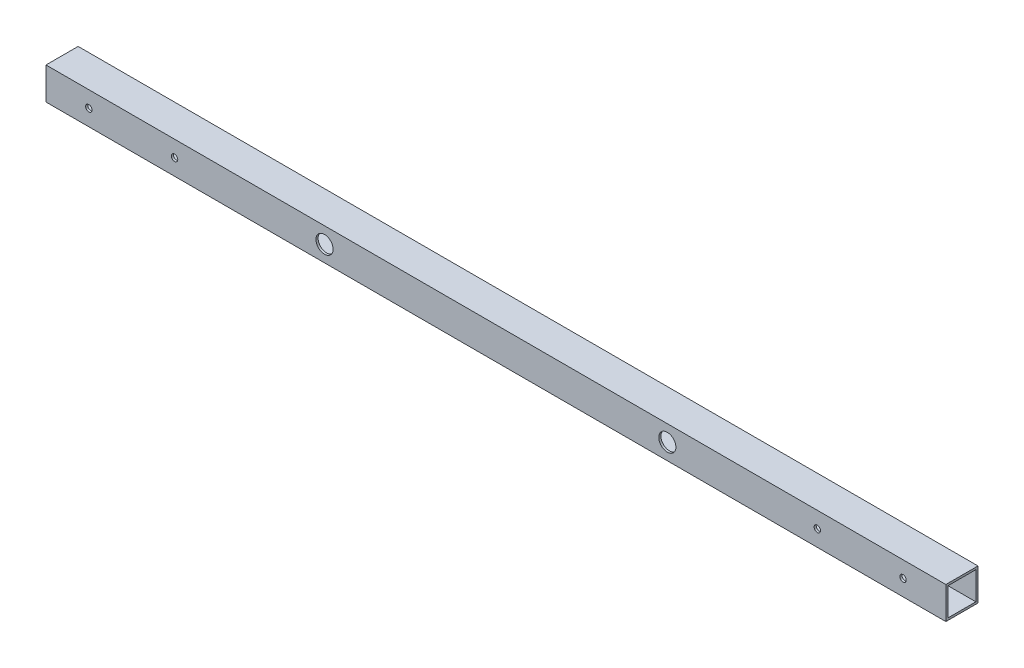
ISO-10303-21;
HEADER;
FILE_DESCRIPTION(('STEP AP214'),'2;1');
FILE_NAME('part.step','',(''),(''),'','','');
FILE_SCHEMA(('AUTOMOTIVE_DESIGN { 1 0 10303 214 1 1 1 1 }'));
ENDSEC;
DATA;
#1=APPLICATION_CONTEXT('core data for automotive mechanical design processes');
#2=APPLICATION_PROTOCOL_DEFINITION('international standard','automotive_design',2000,#1);
#3=PRODUCT_CONTEXT('',#1,'mechanical');
#4=PRODUCT('Part','Part','',(#3));
#5=PRODUCT_RELATED_PRODUCT_CATEGORY('part','',(#4));
#6=PRODUCT_DEFINITION_FORMATION('','',#4);
#7=PRODUCT_DEFINITION_CONTEXT('part definition',#1,'design');
#8=PRODUCT_DEFINITION('design','',#6,#7);
#9=PRODUCT_DEFINITION_SHAPE('','',#8);
#10=(LENGTH_UNIT() NAMED_UNIT(*) SI_UNIT(.MILLI.,.METRE.));
#11=(NAMED_UNIT(*) PLANE_ANGLE_UNIT() SI_UNIT($,.RADIAN.));
#12=(NAMED_UNIT(*) SI_UNIT($,.STERADIAN.) SOLID_ANGLE_UNIT());
#13=UNCERTAINTY_MEASURE_WITH_UNIT(LENGTH_MEASURE(1.E-05),#10,'distance_accuracy_value','');
#14=(GEOMETRIC_REPRESENTATION_CONTEXT(3) GLOBAL_UNCERTAINTY_ASSIGNED_CONTEXT((#13)) GLOBAL_UNIT_ASSIGNED_CONTEXT((#10,
#11,#12)) REPRESENTATION_CONTEXT('',''));
#15=CARTESIAN_POINT('',(0.,0.,0.));
#16=DIRECTION('',(0.,0.,1.));
#17=DIRECTION('',(1.,0.,0.));
#18=AXIS2_PLACEMENT_3D('',#15,#16,#17);
#19=CARTESIAN_POINT('',(420.,0.,0.));
#20=DIRECTION('',(-1.,0.,0.));
#21=DIRECTION('',(0.,0.,1.));
#22=AXIS2_PLACEMENT_3D('',#19,#20,#21);
#23=PLANE('',#22);
#24=DIRECTION('',(0.,1.,0.));
#25=VECTOR('',#24,1.);
#26=CARTESIAN_POINT('',(420.,-7.5,-7.5));
#27=LINE('',#26,#25);
#28=CARTESIAN_POINT('',(420.,-7.5,-7.5));
#29=VERTEX_POINT('',#28);
#30=CARTESIAN_POINT('',(420.,7.5,-7.5));
#31=VERTEX_POINT('',#30);
#32=EDGE_CURVE('E142',#29,#31,#27,.T.);
#33=ORIENTED_EDGE('',*,*,#32,.T.);
#34=DIRECTION('',(0.,0.,1.));
#35=VECTOR('',#34,1.);
#36=CARTESIAN_POINT('',(420.,7.5,7.5));
#37=LINE('',#36,#35);
#38=CARTESIAN_POINT('',(420.,7.5,7.5));
#39=VERTEX_POINT('',#38);
#40=EDGE_CURVE('E145',#31,#39,#37,.T.);
#41=ORIENTED_EDGE('',*,*,#40,.T.);
#42=DIRECTION('',(0.,-1.,0.));
#43=VECTOR('',#42,1.);
#44=CARTESIAN_POINT('',(420.,-7.5,7.5));
#45=LINE('',#44,#43);
#46=CARTESIAN_POINT('',(420.,-7.5,7.5));
#47=VERTEX_POINT('',#46);
#48=EDGE_CURVE('E148',#39,#47,#45,.T.);
#49=ORIENTED_EDGE('',*,*,#48,.T.);
#50=DIRECTION('',(0.,0.,-1.));
#51=VECTOR('',#50,1.);
#52=CARTESIAN_POINT('',(420.,-7.5,7.5));
#53=LINE('',#52,#51);
#54=EDGE_CURVE('E150',#47,#29,#53,.T.);
#55=ORIENTED_EDGE('',*,*,#54,.T.);
#56=EDGE_LOOP('',(#33,#41,#49,#55));
#57=FACE_BOUND('',#56,.T.);
#58=DIRECTION('',(0.,-1.,0.));
#59=VECTOR('',#58,1.);
#60=CARTESIAN_POINT('',(420.,-6.5,6.5));
#61=LINE('',#60,#59);
#62=CARTESIAN_POINT('',(420.,6.5,6.5));
#63=VERTEX_POINT('',#62);
#64=CARTESIAN_POINT('',(420.,-6.5,6.5));
#65=VERTEX_POINT('',#64);
#66=EDGE_CURVE('E104',#63,#65,#61,.T.);
#67=ORIENTED_EDGE('',*,*,#66,.F.);
#68=DIRECTION('',(0.,0.,1.));
#69=VECTOR('',#68,1.);
#70=CARTESIAN_POINT('',(420.,6.5,6.5));
#71=LINE('',#70,#69);
#72=CARTESIAN_POINT('',(420.,6.5,-6.5));
#73=VERTEX_POINT('',#72);
#74=EDGE_CURVE('E126',#73,#63,#71,.T.);
#75=ORIENTED_EDGE('',*,*,#74,.F.);
#76=DIRECTION('',(0.,1.,0.));
#77=VECTOR('',#76,1.);
#78=CARTESIAN_POINT('',(420.,-6.5,-6.5));
#79=LINE('',#78,#77);
#80=CARTESIAN_POINT('',(420.,-6.5,-6.5));
#81=VERTEX_POINT('',#80);
#82=EDGE_CURVE('E124',#81,#73,#79,.T.);
#83=ORIENTED_EDGE('',*,*,#82,.F.);
#84=DIRECTION('',(0.,0.,-1.));
#85=VECTOR('',#84,1.);
#86=CARTESIAN_POINT('',(420.,-6.5,6.5));
#87=LINE('',#86,#85);
#88=EDGE_CURVE('E112',#65,#81,#87,.T.);
#89=ORIENTED_EDGE('',*,*,#88,.F.);
#90=EDGE_LOOP('',(#67,#75,#83,#89));
#91=FACE_BOUND('',#90,.T.);
#92=ADVANCED_FACE('F37',(#57,#91),#23,.F.);
#93=CARTESIAN_POINT('',(0.,0.,0.));
#94=DIRECTION('',(-1.,0.,0.));
#95=DIRECTION('',(0.,0.,1.));
#96=AXIS2_PLACEMENT_3D('',#93,#94,#95);
#97=PLANE('',#96);
#98=DIRECTION('',(0.,1.,0.));
#99=VECTOR('',#98,1.);
#100=CARTESIAN_POINT('',(0.,-7.5,-7.5));
#101=LINE('',#100,#99);
#102=CARTESIAN_POINT('',(0.,-7.5,-7.5));
#103=VERTEX_POINT('',#102);
#104=CARTESIAN_POINT('',(0.,7.5,-7.5));
#105=VERTEX_POINT('',#104);
#106=EDGE_CURVE('E120',#103,#105,#101,.T.);
#107=ORIENTED_EDGE('',*,*,#106,.F.);
#108=DIRECTION('',(0.,0.,-1.));
#109=VECTOR('',#108,1.);
#110=CARTESIAN_POINT('',(0.,-7.5,7.5));
#111=LINE('',#110,#109);
#112=CARTESIAN_POINT('',(0.,-7.5,7.5));
#113=VERTEX_POINT('',#112);
#114=EDGE_CURVE('E146',#113,#103,#111,.T.);
#115=ORIENTED_EDGE('',*,*,#114,.F.);
#116=DIRECTION('',(0.,-1.,0.));
#117=VECTOR('',#116,1.);
#118=CARTESIAN_POINT('',(0.,-7.5,7.5));
#119=LINE('',#118,#117);
#120=CARTESIAN_POINT('',(0.,7.5,7.5));
#121=VERTEX_POINT('',#120);
#122=EDGE_CURVE('E157',#121,#113,#119,.T.);
#123=ORIENTED_EDGE('',*,*,#122,.F.);
#124=DIRECTION('',(0.,0.,1.));
#125=VECTOR('',#124,1.);
#126=CARTESIAN_POINT('',(0.,7.5,7.5));
#127=LINE('',#126,#125);
#128=EDGE_CURVE('E155',#105,#121,#127,.T.);
#129=ORIENTED_EDGE('',*,*,#128,.F.);
#130=EDGE_LOOP('',(#107,#115,#123,#129));
#131=FACE_BOUND('',#130,.T.);
#132=DIRECTION('',(0.,0.,1.));
#133=VECTOR('',#132,1.);
#134=CARTESIAN_POINT('',(0.,6.5,6.5));
#135=LINE('',#134,#133);
#136=CARTESIAN_POINT('',(0.,6.5,-6.5));
#137=VERTEX_POINT('',#136);
#138=CARTESIAN_POINT('',(0.,6.5,6.5));
#139=VERTEX_POINT('',#138);
#140=EDGE_CURVE('E113',#137,#139,#135,.T.);
#141=ORIENTED_EDGE('',*,*,#140,.T.);
#142=DIRECTION('',(0.,-1.,0.));
#143=VECTOR('',#142,1.);
#144=CARTESIAN_POINT('',(0.,-6.5,6.5));
#145=LINE('',#144,#143);
#146=CARTESIAN_POINT('',(0.,-6.5,6.5));
#147=VERTEX_POINT('',#146);
#148=EDGE_CURVE('E62',#139,#147,#145,.T.);
#149=ORIENTED_EDGE('',*,*,#148,.T.);
#150=DIRECTION('',(0.,0.,-1.));
#151=VECTOR('',#150,1.);
#152=CARTESIAN_POINT('',(0.,-6.5,6.5));
#153=LINE('',#152,#151);
#154=CARTESIAN_POINT('',(0.,-6.5,-6.5));
#155=VERTEX_POINT('',#154);
#156=EDGE_CURVE('E119',#147,#155,#153,.T.);
#157=ORIENTED_EDGE('',*,*,#156,.T.);
#158=DIRECTION('',(0.,1.,0.));
#159=VECTOR('',#158,1.);
#160=CARTESIAN_POINT('',(0.,-6.5,-6.5));
#161=LINE('',#160,#159);
#162=EDGE_CURVE('E134',#155,#137,#161,.T.);
#163=ORIENTED_EDGE('',*,*,#162,.T.);
#164=EDGE_LOOP('',(#141,#149,#157,#163));
#165=FACE_BOUND('',#164,.T.);
#166=ADVANCED_FACE('F258',(#131,#165),#97,.T.);
#167=CARTESIAN_POINT('',(420.,-7.5,-7.5));
#168=DIRECTION('',(0.,0.,1.));
#169=DIRECTION('',(1.,0.,0.));
#170=AXIS2_PLACEMENT_3D('',#167,#168,#169);
#171=PLANE('',#170);
#172=CARTESIAN_POINT('',(60.,0.,-7.5));
#173=DIRECTION('',(0.,0.,1.));
#174=DIRECTION('',(1.,0.,0.));
#175=AXIS2_PLACEMENT_3D('',#172,#173,#174);
#176=CIRCLE('',#175,1.5);
#177=CARTESIAN_POINT('',(61.5,0.,-7.5));
#178=VERTEX_POINT('',#177);
#179=EDGE_CURVE('E175',#178,#178,#176,.T.);
#180=ORIENTED_EDGE('',*,*,#179,.T.);
#181=EDGE_LOOP('',(#180));
#182=FACE_BOUND('',#181,.T.);
#183=CARTESIAN_POINT('',(130.,0.,-7.5));
#184=DIRECTION('',(0.,0.,1.));
#185=DIRECTION('',(1.,0.,0.));
#186=AXIS2_PLACEMENT_3D('',#183,#184,#185);
#187=CIRCLE('',#186,1.5);
#188=CARTESIAN_POINT('',(131.5,0.,-7.5));
#189=VERTEX_POINT('',#188);
#190=EDGE_CURVE('E211',#189,#189,#187,.T.);
#191=ORIENTED_EDGE('',*,*,#190,.T.);
#192=EDGE_LOOP('',(#191));
#193=FACE_BOUND('',#192,.T.);
#194=CARTESIAN_POINT('',(290.,0.,-7.5));
#195=DIRECTION('',(0.,0.,1.));
#196=DIRECTION('',(-1.,0.,0.));
#197=AXIS2_PLACEMENT_3D('',#194,#195,#196);
#198=CIRCLE('',#197,1.50000000000002);
#199=CARTESIAN_POINT('',(288.5,0.,-7.5));
#200=VERTEX_POINT('',#199);
#201=EDGE_CURVE('E214',#200,#200,#198,.T.);
#202=ORIENTED_EDGE('',*,*,#201,.T.);
#203=EDGE_LOOP('',(#202));
#204=FACE_BOUND('',#203,.T.);
#205=CARTESIAN_POINT('',(360.,0.,-7.5));
#206=DIRECTION('',(0.,0.,1.));
#207=DIRECTION('',(-1.,0.,0.));
#208=AXIS2_PLACEMENT_3D('',#205,#206,#207);
#209=CIRCLE('',#208,1.49999999999997);
#210=CARTESIAN_POINT('',(358.5,0.,-7.5));
#211=VERTEX_POINT('',#210);
#212=EDGE_CURVE('E217',#211,#211,#209,.T.);
#213=ORIENTED_EDGE('',*,*,#212,.T.);
#214=EDGE_LOOP('',(#213));
#215=FACE_BOUND('',#214,.T.);
#216=CARTESIAN_POINT('',(400.,0.,-7.5));
#217=DIRECTION('',(0.,0.,1.));
#218=DIRECTION('',(-1.,0.,0.));
#219=AXIS2_PLACEMENT_3D('',#216,#217,#218);
#220=CIRCLE('',#219,1.50000000000008);
#221=CARTESIAN_POINT('',(398.5,0.,-7.5));
#222=VERTEX_POINT('',#221);
#223=EDGE_CURVE('E196',#222,#222,#220,.T.);
#224=ORIENTED_EDGE('',*,*,#223,.T.);
#225=EDGE_LOOP('',(#224));
#226=FACE_BOUND('',#225,.T.);
#227=CARTESIAN_POINT('',(20.,0.,-7.5));
#228=DIRECTION('',(0.,0.,1.));
#229=DIRECTION('',(1.,0.,0.));
#230=AXIS2_PLACEMENT_3D('',#227,#228,#229);
#231=CIRCLE('',#230,1.5);
#232=CARTESIAN_POINT('',(21.5,0.,-7.5));
#233=VERTEX_POINT('',#232);
#234=EDGE_CURVE('E170',#233,#233,#231,.T.);
#235=ORIENTED_EDGE('',*,*,#234,.T.);
#236=EDGE_LOOP('',(#235));
#237=FACE_BOUND('',#236,.T.);
#238=ORIENTED_EDGE('',*,*,#106,.T.);
#239=DIRECTION('',(-1.,0.,0.));
#240=VECTOR('',#239,1.);
#241=CARTESIAN_POINT('',(420.,7.5,-7.5));
#242=LINE('',#241,#240);
#243=EDGE_CURVE('E11',#31,#105,#242,.T.);
#244=ORIENTED_EDGE('',*,*,#243,.F.);
#245=ORIENTED_EDGE('',*,*,#32,.F.);
#246=DIRECTION('',(-1.,0.,0.));
#247=VECTOR('',#246,1.);
#248=CARTESIAN_POINT('',(420.,-7.5,-7.5));
#249=LINE('',#248,#247);
#250=EDGE_CURVE('E152',#29,#103,#249,.T.);
#251=ORIENTED_EDGE('',*,*,#250,.T.);
#252=EDGE_LOOP('',(#238,#244,#245,#251));
#253=FACE_BOUND('',#252,.T.);
#254=ADVANCED_FACE('F39',(#182,#193,#204,#215,#226,#237,#253),#171,.F.);
#255=CARTESIAN_POINT('',(420.,7.5,7.5));
#256=DIRECTION('',(0.,-1.,0.));
#257=DIRECTION('',(0.,0.,-1.));
#258=AXIS2_PLACEMENT_3D('',#255,#256,#257);
#259=PLANE('',#258);
#260=ORIENTED_EDGE('',*,*,#128,.T.);
#261=DIRECTION('',(-1.,0.,0.));
#262=VECTOR('',#261,1.);
#263=CARTESIAN_POINT('',(420.,7.5,7.5));
#264=LINE('',#263,#262);
#265=EDGE_CURVE('E46',#39,#121,#264,.T.);
#266=ORIENTED_EDGE('',*,*,#265,.F.);
#267=ORIENTED_EDGE('',*,*,#40,.F.);
#268=ORIENTED_EDGE('',*,*,#243,.T.);
#269=EDGE_LOOP('',(#260,#266,#267,#268));
#270=FACE_BOUND('',#269,.T.);
#271=ADVANCED_FACE('F267',(#270),#259,.F.);
#272=CARTESIAN_POINT('',(420.,-7.5,7.5));
#273=DIRECTION('',(0.,0.,-1.));
#274=DIRECTION('',(-1.,0.,0.));
#275=AXIS2_PLACEMENT_3D('',#272,#273,#274);
#276=PLANE('',#275);
#277=CARTESIAN_POINT('',(290.,0.,7.5));
#278=DIRECTION('',(0.,0.,1.));
#279=DIRECTION('',(1.,0.,0.));
#280=AXIS2_PLACEMENT_3D('',#277,#278,#279);
#281=CIRCLE('',#280,3.99999999999999);
#282=CARTESIAN_POINT('',(294.,0.,7.5));
#283=VERTEX_POINT('',#282);
#284=EDGE_CURVE('E203',#283,#283,#281,.T.);
#285=ORIENTED_EDGE('',*,*,#284,.F.);
#286=EDGE_LOOP('',(#285));
#287=FACE_BOUND('',#286,.T.);
#288=CARTESIAN_POINT('',(130.,0.,7.5));
#289=DIRECTION('',(0.,0.,1.));
#290=DIRECTION('',(1.,0.,0.));
#291=AXIS2_PLACEMENT_3D('',#288,#289,#290);
#292=CIRCLE('',#291,3.99999999999999);
#293=CARTESIAN_POINT('',(134.,0.,7.5));
#294=VERTEX_POINT('',#293);
#295=EDGE_CURVE('E192',#294,#294,#292,.T.);
#296=ORIENTED_EDGE('',*,*,#295,.F.);
#297=EDGE_LOOP('',(#296));
#298=FACE_BOUND('',#297,.T.);
#299=CARTESIAN_POINT('',(60.,0.,7.5));
#300=DIRECTION('',(0.,0.,1.));
#301=DIRECTION('',(1.,0.,0.));
#302=AXIS2_PLACEMENT_3D('',#299,#300,#301);
#303=CIRCLE('',#302,1.5);
#304=CARTESIAN_POINT('',(61.5,0.,7.5));
#305=VERTEX_POINT('',#304);
#306=EDGE_CURVE('E208',#305,#305,#303,.T.);
#307=ORIENTED_EDGE('',*,*,#306,.F.);
#308=EDGE_LOOP('',(#307));
#309=FACE_BOUND('',#308,.T.);
#310=CARTESIAN_POINT('',(360.,0.,7.5));
#311=DIRECTION('',(0.,0.,1.));
#312=DIRECTION('',(-1.,0.,0.));
#313=AXIS2_PLACEMENT_3D('',#310,#311,#312);
#314=CIRCLE('',#313,1.49999999999997);
#315=CARTESIAN_POINT('',(358.5,0.,7.5));
#316=VERTEX_POINT('',#315);
#317=EDGE_CURVE('E220',#316,#316,#314,.T.);
#318=ORIENTED_EDGE('',*,*,#317,.F.);
#319=EDGE_LOOP('',(#318));
#320=FACE_BOUND('',#319,.T.);
#321=CARTESIAN_POINT('',(400.,0.,7.5));
#322=DIRECTION('',(0.,0.,1.));
#323=DIRECTION('',(-1.,0.,0.));
#324=AXIS2_PLACEMENT_3D('',#321,#322,#323);
#325=CIRCLE('',#324,1.50000000000008);
#326=CARTESIAN_POINT('',(398.5,0.,7.5));
#327=VERTEX_POINT('',#326);
#328=EDGE_CURVE('E191',#327,#327,#325,.T.);
#329=ORIENTED_EDGE('',*,*,#328,.F.);
#330=EDGE_LOOP('',(#329));
#331=FACE_BOUND('',#330,.T.);
#332=CARTESIAN_POINT('',(20.,0.,7.5));
#333=DIRECTION('',(0.,0.,1.));
#334=DIRECTION('',(1.,0.,0.));
#335=AXIS2_PLACEMENT_3D('',#332,#333,#334);
#336=CIRCLE('',#335,1.5);
#337=CARTESIAN_POINT('',(21.5,0.,7.5));
#338=VERTEX_POINT('',#337);
#339=EDGE_CURVE('E231',#338,#338,#336,.T.);
#340=ORIENTED_EDGE('',*,*,#339,.F.);
#341=EDGE_LOOP('',(#340));
#342=FACE_BOUND('',#341,.T.);
#343=ORIENTED_EDGE('',*,*,#122,.T.);
#344=DIRECTION('',(-1.,0.,0.));
#345=VECTOR('',#344,1.);
#346=CARTESIAN_POINT('',(420.,-7.5,7.5));
#347=LINE('',#346,#345);
#348=EDGE_CURVE('E162',#47,#113,#347,.T.);
#349=ORIENTED_EDGE('',*,*,#348,.F.);
#350=ORIENTED_EDGE('',*,*,#48,.F.);
#351=ORIENTED_EDGE('',*,*,#265,.T.);
#352=EDGE_LOOP('',(#343,#349,#350,#351));
#353=FACE_BOUND('',#352,.T.);
#354=ADVANCED_FACE('F251',(#287,#298,#309,#320,#331,#342,#353),#276,.F.);
#355=CARTESIAN_POINT('',(420.,-7.5,7.5));
#356=DIRECTION('',(0.,1.,0.));
#357=DIRECTION('',(0.,0.,1.));
#358=AXIS2_PLACEMENT_3D('',#355,#356,#357);
#359=PLANE('',#358);
#360=ORIENTED_EDGE('',*,*,#114,.T.);
#361=ORIENTED_EDGE('',*,*,#250,.F.);
#362=ORIENTED_EDGE('',*,*,#54,.F.);
#363=ORIENTED_EDGE('',*,*,#348,.T.);
#364=EDGE_LOOP('',(#360,#361,#362,#363));
#365=FACE_BOUND('',#364,.T.);
#366=ADVANCED_FACE('F242',(#365),#359,.F.);
#367=CARTESIAN_POINT('',(420.,-6.5,6.5));
#368=DIRECTION('',(0.,0.,-1.));
#369=DIRECTION('',(-1.,0.,0.));
#370=AXIS2_PLACEMENT_3D('',#367,#368,#369);
#371=PLANE('',#370);
#372=CARTESIAN_POINT('',(290.,0.,6.5));
#373=DIRECTION('',(0.,0.,-1.));
#374=DIRECTION('',(-1.,0.,0.));
#375=AXIS2_PLACEMENT_3D('',#372,#373,#374);
#376=CIRCLE('',#375,3.99999999999999);
#377=CARTESIAN_POINT('',(286.,0.,6.5));
#378=VERTEX_POINT('',#377);
#379=EDGE_CURVE('E41',#378,#378,#376,.T.);
#380=ORIENTED_EDGE('',*,*,#379,.F.);
#381=EDGE_LOOP('',(#380));
#382=FACE_BOUND('',#381,.T.);
#383=CARTESIAN_POINT('',(130.,0.,6.5));
#384=DIRECTION('',(0.,0.,-1.));
#385=DIRECTION('',(-1.,0.,0.));
#386=AXIS2_PLACEMENT_3D('',#383,#384,#385);
#387=CIRCLE('',#386,3.99999999999999);
#388=CARTESIAN_POINT('',(126.,0.,6.5));
#389=VERTEX_POINT('',#388);
#390=EDGE_CURVE('E189',#389,#389,#387,.T.);
#391=ORIENTED_EDGE('',*,*,#390,.F.);
#392=EDGE_LOOP('',(#391));
#393=FACE_BOUND('',#392,.T.);
#394=CARTESIAN_POINT('',(60.,0.,6.5));
#395=DIRECTION('',(0.,0.,-1.));
#396=DIRECTION('',(-1.,0.,0.));
#397=AXIS2_PLACEMENT_3D('',#394,#395,#396);
#398=CIRCLE('',#397,1.5);
#399=CARTESIAN_POINT('',(58.5,0.,6.5));
#400=VERTEX_POINT('',#399);
#401=EDGE_CURVE('E188',#400,#400,#398,.T.);
#402=ORIENTED_EDGE('',*,*,#401,.F.);
#403=EDGE_LOOP('',(#402));
#404=FACE_BOUND('',#403,.T.);
#405=CARTESIAN_POINT('',(360.,0.,6.5));
#406=DIRECTION('',(0.,0.,-1.));
#407=DIRECTION('',(-1.,0.,0.));
#408=AXIS2_PLACEMENT_3D('',#405,#406,#407);
#409=CIRCLE('',#408,1.49999999999997);
#410=CARTESIAN_POINT('',(358.5,0.,6.5));
#411=VERTEX_POINT('',#410);
#412=EDGE_CURVE('E179',#411,#411,#409,.T.);
#413=ORIENTED_EDGE('',*,*,#412,.F.);
#414=EDGE_LOOP('',(#413));
#415=FACE_BOUND('',#414,.T.);
#416=CARTESIAN_POINT('',(400.,0.,6.5));
#417=DIRECTION('',(0.,0.,-1.));
#418=DIRECTION('',(-1.,0.,0.));
#419=AXIS2_PLACEMENT_3D('',#416,#417,#418);
#420=CIRCLE('',#419,1.50000000000008);
#421=CARTESIAN_POINT('',(398.5,0.,6.5));
#422=VERTEX_POINT('',#421);
#423=EDGE_CURVE('E174',#422,#422,#420,.T.);
#424=ORIENTED_EDGE('',*,*,#423,.F.);
#425=EDGE_LOOP('',(#424));
#426=FACE_BOUND('',#425,.T.);
#427=CARTESIAN_POINT('',(20.,0.,6.5));
#428=DIRECTION('',(0.,0.,-1.));
#429=DIRECTION('',(-1.,0.,0.));
#430=AXIS2_PLACEMENT_3D('',#427,#428,#429);
#431=CIRCLE('',#430,1.5);
#432=CARTESIAN_POINT('',(18.5,0.,6.5));
#433=VERTEX_POINT('',#432);
#434=EDGE_CURVE('E132',#433,#433,#431,.T.);
#435=ORIENTED_EDGE('',*,*,#434,.F.);
#436=EDGE_LOOP('',(#435));
#437=FACE_BOUND('',#436,.T.);
#438=ORIENTED_EDGE('',*,*,#148,.F.);
#439=DIRECTION('',(-1.,0.,0.));
#440=VECTOR('',#439,1.);
#441=CARTESIAN_POINT('',(420.,6.5,6.5));
#442=LINE('',#441,#440);
#443=EDGE_CURVE('E108',#63,#139,#442,.T.);
#444=ORIENTED_EDGE('',*,*,#443,.F.);
#445=ORIENTED_EDGE('',*,*,#66,.T.);
#446=DIRECTION('',(-1.,0.,0.));
#447=VECTOR('',#446,1.);
#448=CARTESIAN_POINT('',(420.,-6.5,6.5));
#449=LINE('',#448,#447);
#450=EDGE_CURVE('E107',#65,#147,#449,.T.);
#451=ORIENTED_EDGE('',*,*,#450,.T.);
#452=EDGE_LOOP('',(#438,#444,#445,#451));
#453=FACE_BOUND('',#452,.T.);
#454=ADVANCED_FACE('F106',(#382,#393,#404,#415,#426,#437,#453),#371,.T.);
#455=CARTESIAN_POINT('',(420.,-6.5,6.5));
#456=DIRECTION('',(0.,1.,0.));
#457=DIRECTION('',(0.,0.,1.));
#458=AXIS2_PLACEMENT_3D('',#455,#456,#457);
#459=PLANE('',#458);
#460=ORIENTED_EDGE('',*,*,#156,.F.);
#461=ORIENTED_EDGE('',*,*,#450,.F.);
#462=ORIENTED_EDGE('',*,*,#88,.T.);
#463=DIRECTION('',(-1.,0.,0.));
#464=VECTOR('',#463,1.);
#465=CARTESIAN_POINT('',(420.,-6.5,-6.5));
#466=LINE('',#465,#464);
#467=EDGE_CURVE('E121',#81,#155,#466,.T.);
#468=ORIENTED_EDGE('',*,*,#467,.T.);
#469=EDGE_LOOP('',(#460,#461,#462,#468));
#470=FACE_BOUND('',#469,.T.);
#471=ADVANCED_FACE('F116',(#470),#459,.T.);
#472=CARTESIAN_POINT('',(420.,-6.5,-6.5));
#473=DIRECTION('',(0.,0.,1.));
#474=DIRECTION('',(0.,-1.,0.));
#475=AXIS2_PLACEMENT_3D('',#472,#473,#474);
#476=PLANE('',#475);
#477=CARTESIAN_POINT('',(60.,0.,-6.5));
#478=DIRECTION('',(0.,0.,1.));
#479=DIRECTION('',(0.,-1.,0.));
#480=AXIS2_PLACEMENT_3D('',#477,#478,#479);
#481=CIRCLE('',#480,1.5);
#482=CARTESIAN_POINT('',(60.,-1.5,-6.5));
#483=VERTEX_POINT('',#482);
#484=EDGE_CURVE('E186',#483,#483,#481,.T.);
#485=ORIENTED_EDGE('',*,*,#484,.F.);
#486=EDGE_LOOP('',(#485));
#487=FACE_BOUND('',#486,.T.);
#488=CARTESIAN_POINT('',(130.,0.,-6.5));
#489=DIRECTION('',(0.,0.,1.));
#490=DIRECTION('',(0.,-1.,0.));
#491=AXIS2_PLACEMENT_3D('',#488,#489,#490);
#492=CIRCLE('',#491,1.5);
#493=CARTESIAN_POINT('',(130.,-1.5,-6.5));
#494=VERTEX_POINT('',#493);
#495=EDGE_CURVE('E183',#494,#494,#492,.T.);
#496=ORIENTED_EDGE('',*,*,#495,.F.);
#497=EDGE_LOOP('',(#496));
#498=FACE_BOUND('',#497,.T.);
#499=CARTESIAN_POINT('',(290.,0.,-6.5));
#500=DIRECTION('',(0.,0.,1.));
#501=DIRECTION('',(0.,-1.,0.));
#502=AXIS2_PLACEMENT_3D('',#499,#500,#501);
#503=CIRCLE('',#502,1.50000000000002);
#504=CARTESIAN_POINT('',(290.,-1.50000000000002,-6.5));
#505=VERTEX_POINT('',#504);
#506=EDGE_CURVE('E180',#505,#505,#503,.T.);
#507=ORIENTED_EDGE('',*,*,#506,.F.);
#508=EDGE_LOOP('',(#507));
#509=FACE_BOUND('',#508,.T.);
#510=CARTESIAN_POINT('',(360.,0.,-6.5));
#511=DIRECTION('',(0.,0.,1.));
#512=DIRECTION('',(0.,-1.,0.));
#513=AXIS2_PLACEMENT_3D('',#510,#511,#512);
#514=CIRCLE('',#513,1.49999999999997);
#515=CARTESIAN_POINT('',(360.,-1.49999999999997,-6.5));
#516=VERTEX_POINT('',#515);
#517=EDGE_CURVE('E176',#516,#516,#514,.T.);
#518=ORIENTED_EDGE('',*,*,#517,.F.);
#519=EDGE_LOOP('',(#518));
#520=FACE_BOUND('',#519,.T.);
#521=CARTESIAN_POINT('',(400.,0.,-6.5));
#522=DIRECTION('',(0.,0.,1.));
#523=DIRECTION('',(0.,-1.,0.));
#524=AXIS2_PLACEMENT_3D('',#521,#522,#523);
#525=CIRCLE('',#524,1.50000000000008);
#526=CARTESIAN_POINT('',(400.,-1.50000000000008,-6.5));
#527=VERTEX_POINT('',#526);
#528=EDGE_CURVE('E171',#527,#527,#525,.T.);
#529=ORIENTED_EDGE('',*,*,#528,.F.);
#530=EDGE_LOOP('',(#529));
#531=FACE_BOUND('',#530,.T.);
#532=CARTESIAN_POINT('',(20.,0.,-6.5));
#533=DIRECTION('',(0.,0.,1.));
#534=DIRECTION('',(0.,-1.,0.));
#535=AXIS2_PLACEMENT_3D('',#532,#533,#534);
#536=CIRCLE('',#535,1.5);
#537=CARTESIAN_POINT('',(20.,-1.5,-6.5));
#538=VERTEX_POINT('',#537);
#539=EDGE_CURVE('E167',#538,#538,#536,.T.);
#540=ORIENTED_EDGE('',*,*,#539,.F.);
#541=EDGE_LOOP('',(#540));
#542=FACE_BOUND('',#541,.T.);
#543=ORIENTED_EDGE('',*,*,#162,.F.);
#544=ORIENTED_EDGE('',*,*,#467,.F.);
#545=ORIENTED_EDGE('',*,*,#82,.T.);
#546=DIRECTION('',(-1.,0.,0.));
#547=VECTOR('',#546,1.);
#548=CARTESIAN_POINT('',(420.,6.5,-6.5));
#549=LINE('',#548,#547);
#550=EDGE_CURVE('E54',#73,#137,#549,.T.);
#551=ORIENTED_EDGE('',*,*,#550,.T.);
#552=EDGE_LOOP('',(#543,#544,#545,#551));
#553=FACE_BOUND('',#552,.T.);
#554=ADVANCED_FACE('F249',(#487,#498,#509,#520,#531,#542,#553),#476,.T.);
#555=CARTESIAN_POINT('',(420.,6.5,6.5));
#556=DIRECTION('',(0.,-1.,0.));
#557=DIRECTION('',(0.,0.,-1.));
#558=AXIS2_PLACEMENT_3D('',#555,#556,#557);
#559=PLANE('',#558);
#560=ORIENTED_EDGE('',*,*,#140,.F.);
#561=ORIENTED_EDGE('',*,*,#550,.F.);
#562=ORIENTED_EDGE('',*,*,#74,.T.);
#563=ORIENTED_EDGE('',*,*,#443,.T.);
#564=EDGE_LOOP('',(#560,#561,#562,#563));
#565=FACE_BOUND('',#564,.T.);
#566=ADVANCED_FACE('F289',(#565),#559,.T.);
#567=CARTESIAN_POINT('',(20.,0.,-7.5));
#568=DIRECTION('',(0.,0.,1.));
#569=DIRECTION('',(1.,0.,0.));
#570=AXIS2_PLACEMENT_3D('',#567,#568,#569);
#571=CYLINDRICAL_SURFACE('',#570,1.5);
#572=ORIENTED_EDGE('',*,*,#539,.T.);
#573=EDGE_LOOP('',(#572));
#574=FACE_BOUND('',#573,.T.);
#575=ORIENTED_EDGE('',*,*,#234,.F.);
#576=EDGE_LOOP('',(#575));
#577=FACE_BOUND('',#576,.T.);
#578=ADVANCED_FACE('F291',(#574,#577),#571,.F.);
#579=ORIENTED_EDGE('',*,*,#434,.T.);
#580=EDGE_LOOP('',(#579));
#581=FACE_BOUND('',#580,.T.);
#582=ORIENTED_EDGE('',*,*,#339,.T.);
#583=EDGE_LOOP('',(#582));
#584=FACE_BOUND('',#583,.T.);
#585=ADVANCED_FACE('F238',(#581,#584),#571,.F.);
#586=CARTESIAN_POINT('',(400.,0.,-7.5));
#587=DIRECTION('',(0.,0.,1.));
#588=DIRECTION('',(1.,0.,0.));
#589=AXIS2_PLACEMENT_3D('',#586,#587,#588);
#590=CYLINDRICAL_SURFACE('',#589,1.50000000000008);
#591=ORIENTED_EDGE('',*,*,#528,.T.);
#592=EDGE_LOOP('',(#591));
#593=FACE_BOUND('',#592,.T.);
#594=ORIENTED_EDGE('',*,*,#223,.F.);
#595=EDGE_LOOP('',(#594));
#596=FACE_BOUND('',#595,.T.);
#597=ADVANCED_FACE('F302',(#593,#596),#590,.F.);
#598=CARTESIAN_POINT('',(360.,0.,-7.5));
#599=DIRECTION('',(0.,0.,1.));
#600=DIRECTION('',(1.,0.,0.));
#601=AXIS2_PLACEMENT_3D('',#598,#599,#600);
#602=CYLINDRICAL_SURFACE('',#601,1.49999999999997);
#603=ORIENTED_EDGE('',*,*,#517,.T.);
#604=EDGE_LOOP('',(#603));
#605=FACE_BOUND('',#604,.T.);
#606=ORIENTED_EDGE('',*,*,#212,.F.);
#607=EDGE_LOOP('',(#606));
#608=FACE_BOUND('',#607,.T.);
#609=ADVANCED_FACE('F305',(#605,#608),#602,.F.);
#610=CARTESIAN_POINT('',(290.,0.,-7.5));
#611=DIRECTION('',(0.,0.,1.));
#612=DIRECTION('',(1.,0.,0.));
#613=AXIS2_PLACEMENT_3D('',#610,#611,#612);
#614=CYLINDRICAL_SURFACE('',#613,1.50000000000002);
#615=ORIENTED_EDGE('',*,*,#506,.T.);
#616=EDGE_LOOP('',(#615));
#617=FACE_BOUND('',#616,.T.);
#618=ORIENTED_EDGE('',*,*,#201,.F.);
#619=EDGE_LOOP('',(#618));
#620=FACE_BOUND('',#619,.T.);
#621=ADVANCED_FACE('F310',(#617,#620),#614,.F.);
#622=CARTESIAN_POINT('',(130.,0.,-7.5));
#623=DIRECTION('',(0.,0.,1.));
#624=DIRECTION('',(1.,0.,0.));
#625=AXIS2_PLACEMENT_3D('',#622,#623,#624);
#626=CYLINDRICAL_SURFACE('',#625,1.5);
#627=ORIENTED_EDGE('',*,*,#495,.T.);
#628=EDGE_LOOP('',(#627));
#629=FACE_BOUND('',#628,.T.);
#630=ORIENTED_EDGE('',*,*,#190,.F.);
#631=EDGE_LOOP('',(#630));
#632=FACE_BOUND('',#631,.T.);
#633=ADVANCED_FACE('F315',(#629,#632),#626,.F.);
#634=CARTESIAN_POINT('',(60.,0.,-7.5));
#635=DIRECTION('',(0.,0.,1.));
#636=DIRECTION('',(1.,0.,0.));
#637=AXIS2_PLACEMENT_3D('',#634,#635,#636);
#638=CYLINDRICAL_SURFACE('',#637,1.5);
#639=ORIENTED_EDGE('',*,*,#484,.T.);
#640=EDGE_LOOP('',(#639));
#641=FACE_BOUND('',#640,.T.);
#642=ORIENTED_EDGE('',*,*,#179,.F.);
#643=EDGE_LOOP('',(#642));
#644=FACE_BOUND('',#643,.T.);
#645=ADVANCED_FACE('F319',(#641,#644),#638,.F.);
#646=ORIENTED_EDGE('',*,*,#423,.T.);
#647=EDGE_LOOP('',(#646));
#648=FACE_BOUND('',#647,.T.);
#649=ORIENTED_EDGE('',*,*,#328,.T.);
#650=EDGE_LOOP('',(#649));
#651=FACE_BOUND('',#650,.T.);
#652=ADVANCED_FACE('F307',(#648,#651),#590,.F.);
#653=ORIENTED_EDGE('',*,*,#412,.T.);
#654=EDGE_LOOP('',(#653));
#655=FACE_BOUND('',#654,.T.);
#656=ORIENTED_EDGE('',*,*,#317,.T.);
#657=EDGE_LOOP('',(#656));
#658=FACE_BOUND('',#657,.T.);
#659=ADVANCED_FACE('F312',(#655,#658),#602,.F.);
#660=ORIENTED_EDGE('',*,*,#401,.T.);
#661=EDGE_LOOP('',(#660));
#662=FACE_BOUND('',#661,.T.);
#663=ORIENTED_EDGE('',*,*,#306,.T.);
#664=EDGE_LOOP('',(#663));
#665=FACE_BOUND('',#664,.T.);
#666=ADVANCED_FACE('F324',(#662,#665),#638,.F.);
#667=CARTESIAN_POINT('',(130.,0.,-2.5));
#668=DIRECTION('',(0.,0.,1.));
#669=DIRECTION('',(1.,0.,0.));
#670=AXIS2_PLACEMENT_3D('',#667,#668,#669);
#671=CYLINDRICAL_SURFACE('',#670,3.99999999999999);
#672=ORIENTED_EDGE('',*,*,#390,.T.);
#673=EDGE_LOOP('',(#672));
#674=FACE_BOUND('',#673,.T.);
#675=ORIENTED_EDGE('',*,*,#295,.T.);
#676=EDGE_LOOP('',(#675));
#677=FACE_BOUND('',#676,.T.);
#678=ADVANCED_FACE('F325',(#674,#677),#671,.F.);
#679=CARTESIAN_POINT('',(290.,0.,-2.5));
#680=DIRECTION('',(0.,0.,1.));
#681=DIRECTION('',(1.,0.,0.));
#682=AXIS2_PLACEMENT_3D('',#679,#680,#681);
#683=CYLINDRICAL_SURFACE('',#682,3.99999999999999);
#684=ORIENTED_EDGE('',*,*,#379,.T.);
#685=EDGE_LOOP('',(#684));
#686=FACE_BOUND('',#685,.T.);
#687=ORIENTED_EDGE('',*,*,#284,.T.);
#688=EDGE_LOOP('',(#687));
#689=FACE_BOUND('',#688,.T.);
#690=ADVANCED_FACE('F328',(#686,#689),#683,.F.);
#691=CLOSED_SHELL('',(#92,#166,#254,#271,#354,#366,#454,#471,#554,#566,#578,#585,#597,#609,#621,
#633,#645,#652,#659,#666,#678,#690));
#692=MANIFOLD_SOLID_BREP('B2',#691);
#693=ADVANCED_BREP_SHAPE_REPRESENTATION('',(#18,#692),#14);
#694=SHAPE_DEFINITION_REPRESENTATION(#9,#693);
ENDSEC;
END-ISO-10303-21;
